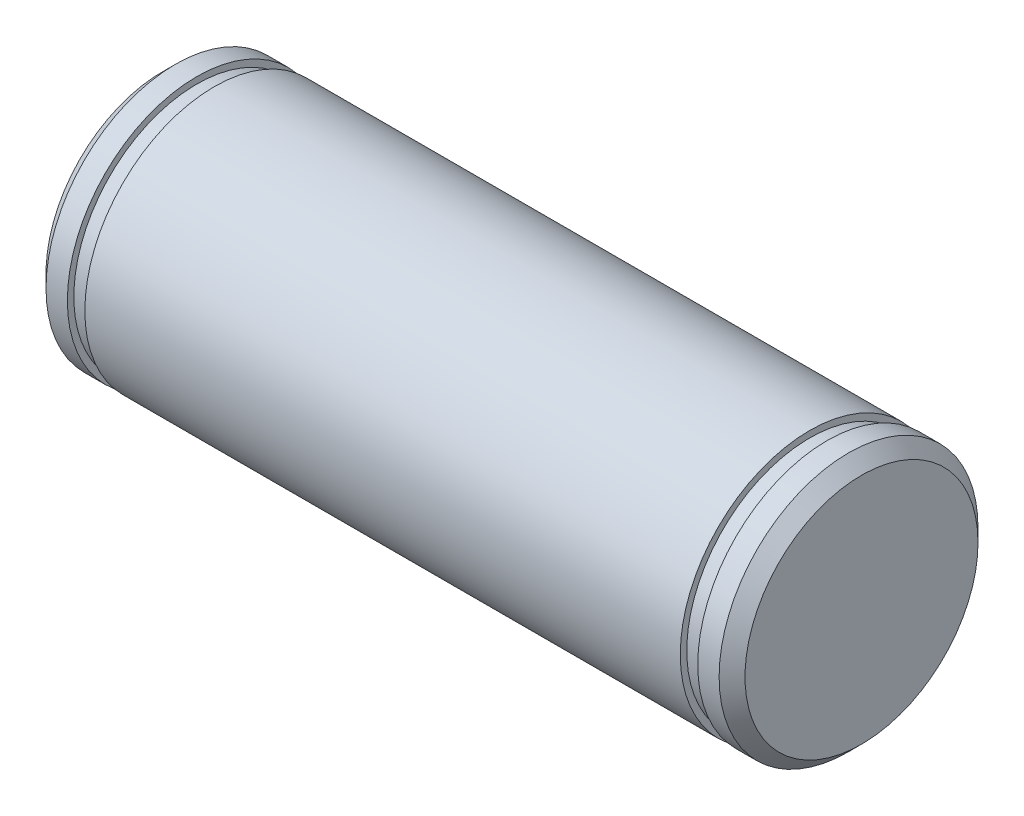
ISO-10303-21;
HEADER;
FILE_DESCRIPTION(('STEP AP214'),'2;1');
FILE_NAME('part.step','',(''),(''),'','','');
FILE_SCHEMA(('AUTOMOTIVE_DESIGN { 1 0 10303 214 1 1 1 1 }'));
ENDSEC;
DATA;
#1=APPLICATION_CONTEXT('core data for automotive mechanical design processes');
#2=APPLICATION_PROTOCOL_DEFINITION('international standard','automotive_design',2000,#1);
#3=PRODUCT_CONTEXT('',#1,'mechanical');
#4=PRODUCT('Part','Part','',(#3));
#5=PRODUCT_RELATED_PRODUCT_CATEGORY('part','',(#4));
#6=PRODUCT_DEFINITION_FORMATION('','',#4);
#7=PRODUCT_DEFINITION_CONTEXT('part definition',#1,'design');
#8=PRODUCT_DEFINITION('design','',#6,#7);
#9=PRODUCT_DEFINITION_SHAPE('','',#8);
#10=(LENGTH_UNIT() NAMED_UNIT(*) SI_UNIT(.MILLI.,.METRE.));
#11=(NAMED_UNIT(*) PLANE_ANGLE_UNIT() SI_UNIT($,.RADIAN.));
#12=(NAMED_UNIT(*) SI_UNIT($,.STERADIAN.) SOLID_ANGLE_UNIT());
#13=UNCERTAINTY_MEASURE_WITH_UNIT(LENGTH_MEASURE(1.E-05),#10,'distance_accuracy_value','');
#14=(GEOMETRIC_REPRESENTATION_CONTEXT(3) GLOBAL_UNCERTAINTY_ASSIGNED_CONTEXT((#13)) GLOBAL_UNIT_ASSIGNED_CONTEXT((#10,
#11,#12)) REPRESENTATION_CONTEXT('',''));
#15=CARTESIAN_POINT('',(0.,0.,0.));
#16=DIRECTION('',(0.,0.,1.));
#17=DIRECTION('',(1.,0.,0.));
#18=AXIS2_PLACEMENT_3D('',#15,#16,#17);
#19=CARTESIAN_POINT('',(27.,0.,0.));
#20=DIRECTION('',(1.,0.,0.));
#21=DIRECTION('',(0.,0.,-1.));
#22=AXIS2_PLACEMENT_3D('',#19,#20,#21);
#23=CYLINDRICAL_SURFACE('',#22,10.);
#24=CARTESIAN_POINT('',(24.35,0.,0.));
#25=DIRECTION('',(1.,0.,0.));
#26=DIRECTION('',(0.,0.,-1.));
#27=AXIS2_PLACEMENT_3D('',#24,#25,#26);
#28=CIRCLE('',#27,10.);
#29=CARTESIAN_POINT('',(24.35,0.,-10.));
#30=VERTEX_POINT('',#29);
#31=EDGE_CURVE('E50',#30,#30,#28,.T.);
#32=ORIENTED_EDGE('',*,*,#31,.T.);
#33=EDGE_LOOP('',(#32));
#34=FACE_BOUND('',#33,.T.);
#35=CARTESIAN_POINT('',(26.,0.,0.));
#36=DIRECTION('',(1.,0.,0.));
#37=DIRECTION('',(0.,0.,-1.));
#38=AXIS2_PLACEMENT_3D('',#35,#36,#37);
#39=CIRCLE('',#38,10.);
#40=CARTESIAN_POINT('',(26.,0.,-10.));
#41=VERTEX_POINT('',#40);
#42=EDGE_CURVE('E10',#41,#41,#39,.T.);
#43=ORIENTED_EDGE('',*,*,#42,.F.);
#44=EDGE_LOOP('',(#43));
#45=FACE_BOUND('',#44,.T.);
#46=ADVANCED_FACE('F16',(#34,#45),#23,.T.);
#47=CARTESIAN_POINT('',(26.,0.,0.));
#48=DIRECTION('',(-1.,0.,0.));
#49=DIRECTION('',(0.,0.,1.));
#50=AXIS2_PLACEMENT_3D('',#47,#48,#49);
#51=CONICAL_SURFACE('',#50,10.,0.785398163397449);
#52=ORIENTED_EDGE('',*,*,#42,.T.);
#53=EDGE_LOOP('',(#52));
#54=FACE_BOUND('',#53,.T.);
#55=CARTESIAN_POINT('',(27.,0.,0.));
#56=DIRECTION('',(1.,0.,0.));
#57=DIRECTION('',(0.,0.,-1.));
#58=AXIS2_PLACEMENT_3D('',#55,#56,#57);
#59=CIRCLE('',#58,9.);
#60=CARTESIAN_POINT('',(27.,0.,-9.));
#61=VERTEX_POINT('',#60);
#62=EDGE_CURVE('E19',#61,#61,#59,.T.);
#63=ORIENTED_EDGE('',*,*,#62,.F.);
#64=EDGE_LOOP('',(#63));
#65=FACE_BOUND('',#64,.T.);
#66=ADVANCED_FACE('F101',(#54,#65),#51,.T.);
#67=CARTESIAN_POINT('',(27.,9.,0.));
#68=DIRECTION('',(-1.,0.,0.));
#69=DIRECTION('',(0.,0.,1.));
#70=AXIS2_PLACEMENT_3D('',#67,#68,#69);
#71=PLANE('',#70);
#72=ORIENTED_EDGE('',*,*,#62,.T.);
#73=EDGE_LOOP('',(#72));
#74=FACE_BOUND('',#73,.T.);
#75=ADVANCED_FACE('F99',(#74),#71,.F.);
#76=CARTESIAN_POINT('',(92.,0.,0.));
#77=DIRECTION('',(1.,0.,0.));
#78=DIRECTION('',(0.,0.,-1.));
#79=AXIS2_PLACEMENT_3D('',#76,#77,#78);
#80=CYLINDRICAL_SURFACE('',#79,9.5);
#81=CARTESIAN_POINT('',(23.,0.,0.));
#82=DIRECTION('',(1.,0.,0.));
#83=DIRECTION('',(0.,0.,-1.));
#84=AXIS2_PLACEMENT_3D('',#81,#82,#83);
#85=CIRCLE('',#84,9.5);
#86=CARTESIAN_POINT('',(23.,0.,-9.5));
#87=VERTEX_POINT('',#86);
#88=EDGE_CURVE('E82',#87,#87,#85,.T.);
#89=ORIENTED_EDGE('',*,*,#88,.T.);
#90=EDGE_LOOP('',(#89));
#91=FACE_BOUND('',#90,.T.);
#92=CARTESIAN_POINT('',(24.35,0.,0.));
#93=DIRECTION('',(1.,0.,0.));
#94=DIRECTION('',(0.,0.,-1.));
#95=AXIS2_PLACEMENT_3D('',#92,#93,#94);
#96=CIRCLE('',#95,9.5);
#97=CARTESIAN_POINT('',(24.35,0.,-9.5));
#98=VERTEX_POINT('',#97);
#99=EDGE_CURVE('E59',#98,#98,#96,.T.);
#100=ORIENTED_EDGE('',*,*,#99,.F.);
#101=EDGE_LOOP('',(#100));
#102=FACE_BOUND('',#101,.T.);
#103=ADVANCED_FACE('F109',(#91,#102),#80,.T.);
#104=CARTESIAN_POINT('',(24.35,9.5,0.));
#105=DIRECTION('',(1.,0.,0.));
#106=DIRECTION('',(0.,1.,0.));
#107=AXIS2_PLACEMENT_3D('',#104,#105,#106);
#108=PLANE('',#107);
#109=ORIENTED_EDGE('',*,*,#99,.T.);
#110=EDGE_LOOP('',(#109));
#111=FACE_BOUND('',#110,.T.);
#112=ORIENTED_EDGE('',*,*,#31,.F.);
#113=EDGE_LOOP('',(#112));
#114=FACE_BOUND('',#113,.T.);
#115=ADVANCED_FACE('F115',(#111,#114),#108,.F.);
#116=CARTESIAN_POINT('',(23.,29.5,0.));
#117=DIRECTION('',(-1.,0.,0.));
#118=DIRECTION('',(0.,0.,1.));
#119=AXIS2_PLACEMENT_3D('',#116,#117,#118);
#120=PLANE('',#119);
#121=CARTESIAN_POINT('',(23.,0.,0.));
#122=DIRECTION('',(-1.,0.,0.));
#123=DIRECTION('',(0.,0.,1.));
#124=AXIS2_PLACEMENT_3D('',#121,#122,#123);
#125=CIRCLE('',#124,10.);
#126=CARTESIAN_POINT('',(23.,0.,10.));
#127=VERTEX_POINT('',#126);
#128=EDGE_CURVE('E257',#127,#127,#125,.T.);
#129=ORIENTED_EDGE('',*,*,#128,.F.);
#130=EDGE_LOOP('',(#129));
#131=FACE_BOUND('',#130,.T.);
#132=ORIENTED_EDGE('',*,*,#88,.F.);
#133=EDGE_LOOP('',(#132));
#134=FACE_BOUND('',#133,.T.);
#135=ADVANCED_FACE('F117',(#131,#134),#120,.F.);
#136=CARTESIAN_POINT('',(92.,0.,0.));
#137=DIRECTION('',(1.,0.,0.));
#138=DIRECTION('',(0.,0.,-1.));
#139=AXIS2_PLACEMENT_3D('',#136,#137,#138);
#140=CYLINDRICAL_SURFACE('',#139,9.5);
#141=CARTESIAN_POINT('',(-24.35,0.,0.));
#142=DIRECTION('',(1.,0.,0.));
#143=DIRECTION('',(0.,0.,-1.));
#144=AXIS2_PLACEMENT_3D('',#141,#142,#143);
#145=CIRCLE('',#144,9.5);
#146=CARTESIAN_POINT('',(-24.35,0.,-9.5));
#147=VERTEX_POINT('',#146);
#148=EDGE_CURVE('E72',#147,#147,#145,.T.);
#149=ORIENTED_EDGE('',*,*,#148,.T.);
#150=EDGE_LOOP('',(#149));
#151=FACE_BOUND('',#150,.T.);
#152=CARTESIAN_POINT('',(-23.,0.,0.));
#153=DIRECTION('',(1.,0.,0.));
#154=DIRECTION('',(0.,0.,-1.));
#155=AXIS2_PLACEMENT_3D('',#152,#153,#154);
#156=CIRCLE('',#155,9.5);
#157=CARTESIAN_POINT('',(-23.,0.,-9.5));
#158=VERTEX_POINT('',#157);
#159=EDGE_CURVE('E77',#158,#158,#156,.T.);
#160=ORIENTED_EDGE('',*,*,#159,.F.);
#161=EDGE_LOOP('',(#160));
#162=FACE_BOUND('',#161,.T.);
#163=ADVANCED_FACE('F113',(#151,#162),#140,.T.);
#164=CARTESIAN_POINT('',(-23.,9.5,0.));
#165=DIRECTION('',(1.,0.,0.));
#166=DIRECTION('',(0.,1.,0.));
#167=AXIS2_PLACEMENT_3D('',#164,#165,#166);
#168=PLANE('',#167);
#169=ORIENTED_EDGE('',*,*,#159,.T.);
#170=EDGE_LOOP('',(#169));
#171=FACE_BOUND('',#170,.T.);
#172=CARTESIAN_POINT('',(-23.,0.,0.));
#173=DIRECTION('',(1.,0.,0.));
#174=DIRECTION('',(0.,0.,-1.));
#175=AXIS2_PLACEMENT_3D('',#172,#173,#174);
#176=CIRCLE('',#175,10.);
#177=CARTESIAN_POINT('',(-23.,0.,-10.));
#178=VERTEX_POINT('',#177);
#179=EDGE_CURVE('E254',#178,#178,#176,.T.);
#180=ORIENTED_EDGE('',*,*,#179,.F.);
#181=EDGE_LOOP('',(#180));
#182=FACE_BOUND('',#181,.T.);
#183=ADVANCED_FACE('F78',(#171,#182),#168,.F.);
#184=CARTESIAN_POINT('',(-24.35,29.5,0.));
#185=DIRECTION('',(-1.,0.,0.));
#186=DIRECTION('',(0.,0.,1.));
#187=AXIS2_PLACEMENT_3D('',#184,#185,#186);
#188=PLANE('',#187);
#189=CARTESIAN_POINT('',(-24.35,0.,0.));
#190=DIRECTION('',(-1.,0.,0.));
#191=DIRECTION('',(0.,0.,1.));
#192=AXIS2_PLACEMENT_3D('',#189,#190,#191);
#193=CIRCLE('',#192,10.);
#194=CARTESIAN_POINT('',(-24.35,0.,10.));
#195=VERTEX_POINT('',#194);
#196=EDGE_CURVE('E247',#195,#195,#193,.T.);
#197=ORIENTED_EDGE('',*,*,#196,.F.);
#198=EDGE_LOOP('',(#197));
#199=FACE_BOUND('',#198,.T.);
#200=ORIENTED_EDGE('',*,*,#148,.F.);
#201=EDGE_LOOP('',(#200));
#202=FACE_BOUND('',#201,.T.);
#203=ADVANCED_FACE('F148',(#199,#202),#188,.F.);
#204=CARTESIAN_POINT('',(-27.,0.,0.));
#205=DIRECTION('',(1.,0.,0.));
#206=DIRECTION('',(0.,0.,-1.));
#207=AXIS2_PLACEMENT_3D('',#204,#205,#206);
#208=CONICAL_SURFACE('',#207,9.,0.785398163397451);
#209=CARTESIAN_POINT('',(-27.,0.,0.));
#210=DIRECTION('',(1.,0.,0.));
#211=DIRECTION('',(0.,0.,-1.));
#212=AXIS2_PLACEMENT_3D('',#209,#210,#211);
#213=CIRCLE('',#212,9.);
#214=CARTESIAN_POINT('',(-27.,0.,-9.));
#215=VERTEX_POINT('',#214);
#216=EDGE_CURVE('E88',#215,#215,#213,.T.);
#217=ORIENTED_EDGE('',*,*,#216,.T.);
#218=EDGE_LOOP('',(#217));
#219=FACE_BOUND('',#218,.T.);
#220=CARTESIAN_POINT('',(-26.,0.,0.));
#221=DIRECTION('',(1.,0.,0.));
#222=DIRECTION('',(0.,0.,-1.));
#223=AXIS2_PLACEMENT_3D('',#220,#221,#222);
#224=CIRCLE('',#223,10.);
#225=CARTESIAN_POINT('',(-26.,0.,-10.));
#226=VERTEX_POINT('',#225);
#227=EDGE_CURVE('E243',#226,#226,#224,.T.);
#228=ORIENTED_EDGE('',*,*,#227,.F.);
#229=EDGE_LOOP('',(#228));
#230=FACE_BOUND('',#229,.T.);
#231=ADVANCED_FACE('F144',(#219,#230),#208,.T.);
#232=CARTESIAN_POINT('',(-27.,0.,0.));
#233=DIRECTION('',(1.,0.,0.));
#234=DIRECTION('',(0.,1.,0.));
#235=AXIS2_PLACEMENT_3D('',#232,#233,#234);
#236=PLANE('',#235);
#237=ORIENTED_EDGE('',*,*,#216,.F.);
#238=EDGE_LOOP('',(#237));
#239=FACE_BOUND('',#238,.T.);
#240=ADVANCED_FACE('F140',(#239),#236,.F.);
#241=CARTESIAN_POINT('',(27.,0.,0.));
#242=DIRECTION('',(1.,0.,0.));
#243=DIRECTION('',(0.,0.,-1.));
#244=AXIS2_PLACEMENT_3D('',#241,#242,#243);
#245=CYLINDRICAL_SURFACE('',#244,10.);
#246=ORIENTED_EDGE('',*,*,#227,.T.);
#247=EDGE_LOOP('',(#246));
#248=FACE_BOUND('',#247,.T.);
#249=ORIENTED_EDGE('',*,*,#196,.T.);
#250=EDGE_LOOP('',(#249));
#251=FACE_BOUND('',#250,.T.);
#252=ADVANCED_FACE('F135',(#248,#251),#245,.T.);
#253=CARTESIAN_POINT('',(27.,0.,0.));
#254=DIRECTION('',(1.,0.,0.));
#255=DIRECTION('',(0.,0.,-1.));
#256=AXIS2_PLACEMENT_3D('',#253,#254,#255);
#257=CYLINDRICAL_SURFACE('',#256,10.);
#258=ORIENTED_EDGE('',*,*,#179,.T.);
#259=EDGE_LOOP('',(#258));
#260=FACE_BOUND('',#259,.T.);
#261=ORIENTED_EDGE('',*,*,#128,.T.);
#262=EDGE_LOOP('',(#261));
#263=FACE_BOUND('',#262,.T.);
#264=ADVANCED_FACE('F133',(#260,#263),#257,.T.);
#265=CLOSED_SHELL('',(#46,#66,#75,#103,#115,#135,#163,#183,#203,#231,#240,#252,#264));
#266=MANIFOLD_SOLID_BREP('B1',#265);
#267=ADVANCED_BREP_SHAPE_REPRESENTATION('',(#18,#266),#14);
#268=SHAPE_DEFINITION_REPRESENTATION(#9,#267);
ENDSEC;
END-ISO-10303-21;
